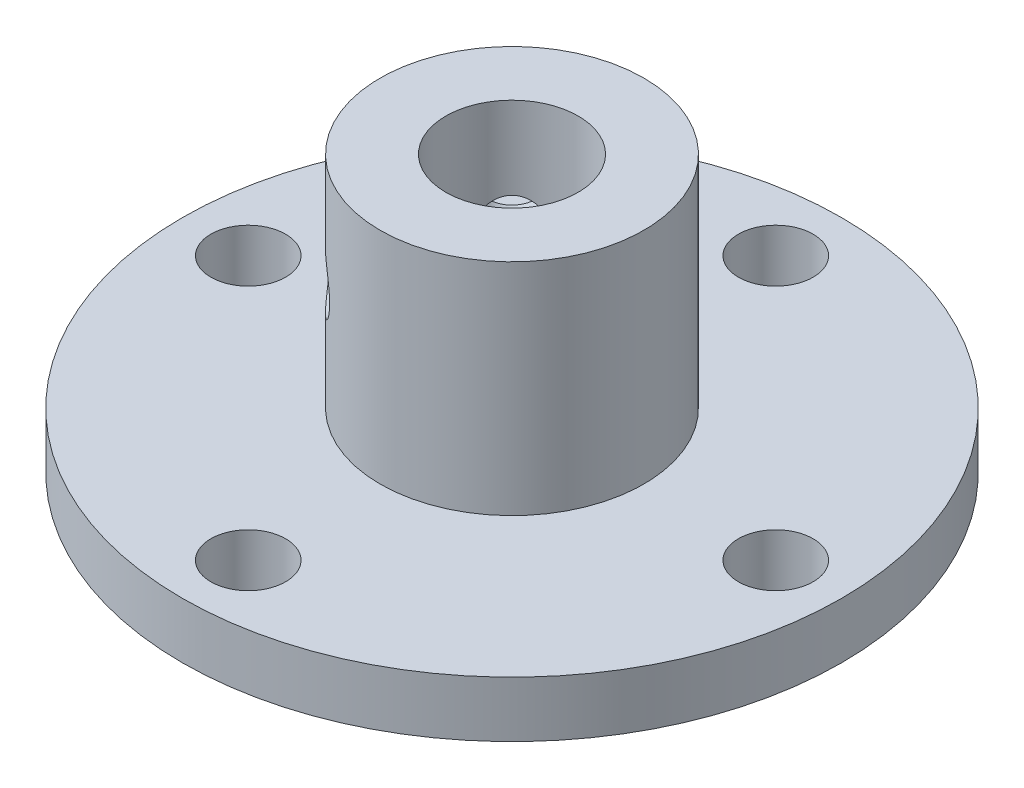
ISO-10303-21;
HEADER;
FILE_DESCRIPTION(('STEP AP214'),'2;1');
FILE_NAME('part.step','',(''),(''),'','','');
FILE_SCHEMA(('AUTOMOTIVE_DESIGN { 1 0 10303 214 1 1 1 1 }'));
ENDSEC;
DATA;
#1=APPLICATION_CONTEXT('core data for automotive mechanical design processes');
#2=APPLICATION_PROTOCOL_DEFINITION('international standard','automotive_design',2000,#1);
#3=PRODUCT_CONTEXT('',#1,'mechanical');
#4=PRODUCT('Part','Part','',(#3));
#5=PRODUCT_RELATED_PRODUCT_CATEGORY('part','',(#4));
#6=PRODUCT_DEFINITION_FORMATION('','',#4);
#7=PRODUCT_DEFINITION_CONTEXT('part definition',#1,'design');
#8=PRODUCT_DEFINITION('design','',#6,#7);
#9=PRODUCT_DEFINITION_SHAPE('','',#8);
#10=(LENGTH_UNIT() NAMED_UNIT(*) SI_UNIT(.MILLI.,.METRE.));
#11=(NAMED_UNIT(*) PLANE_ANGLE_UNIT() SI_UNIT($,.RADIAN.));
#12=(NAMED_UNIT(*) SI_UNIT($,.STERADIAN.) SOLID_ANGLE_UNIT());
#13=UNCERTAINTY_MEASURE_WITH_UNIT(LENGTH_MEASURE(1.E-05),#10,'distance_accuracy_value','');
#14=(GEOMETRIC_REPRESENTATION_CONTEXT(3) GLOBAL_UNCERTAINTY_ASSIGNED_CONTEXT((#13)) GLOBAL_UNIT_ASSIGNED_CONTEXT((#10,
#11,#12)) REPRESENTATION_CONTEXT('',''));
#15=CARTESIAN_POINT('',(0.,0.,0.));
#16=DIRECTION('',(0.,0.,1.));
#17=DIRECTION('',(1.,0.,0.));
#18=AXIS2_PLACEMENT_3D('',#15,#16,#17);
#19=CARTESIAN_POINT('',(0.,0.,0.));
#20=DIRECTION('',(0.,1.,0.));
#21=DIRECTION('',(0.,0.,1.));
#22=AXIS2_PLACEMENT_3D('',#19,#20,#21);
#23=PLANE('',#22);
#24=CARTESIAN_POINT('',(0.,0.,-12.));
#25=DIRECTION('',(0.,1.,0.));
#26=DIRECTION('',(0.,0.,1.));
#27=AXIS2_PLACEMENT_3D('',#24,#25,#26);
#28=CIRCLE('',#27,1.7);
#29=CARTESIAN_POINT('',(0.,0.,-10.3));
#30=VERTEX_POINT('',#29);
#31=EDGE_CURVE('E87',#30,#30,#28,.T.);
#32=ORIENTED_EDGE('',*,*,#31,.F.);
#33=EDGE_LOOP('',(#32));
#34=FACE_BOUND('',#33,.T.);
#35=CARTESIAN_POINT('',(12.,0.,0.));
#36=DIRECTION('',(0.,1.,0.));
#37=DIRECTION('',(0.,0.,1.));
#38=AXIS2_PLACEMENT_3D('',#35,#36,#37);
#39=CIRCLE('',#38,1.7);
#40=CARTESIAN_POINT('',(12.,0.,1.7));
#41=VERTEX_POINT('',#40);
#42=EDGE_CURVE('E81',#41,#41,#39,.T.);
#43=ORIENTED_EDGE('',*,*,#42,.F.);
#44=EDGE_LOOP('',(#43));
#45=FACE_BOUND('',#44,.T.);
#46=CARTESIAN_POINT('',(-12.,0.,0.));
#47=DIRECTION('',(0.,1.,0.));
#48=DIRECTION('',(0.,0.,1.));
#49=AXIS2_PLACEMENT_3D('',#46,#47,#48);
#50=CIRCLE('',#49,1.7);
#51=CARTESIAN_POINT('',(-12.,0.,1.7));
#52=VERTEX_POINT('',#51);
#53=EDGE_CURVE('E75',#52,#52,#50,.T.);
#54=ORIENTED_EDGE('',*,*,#53,.F.);
#55=EDGE_LOOP('',(#54));
#56=FACE_BOUND('',#55,.T.);
#57=CARTESIAN_POINT('',(0.,0.,12.));
#58=DIRECTION('',(0.,1.,0.));
#59=DIRECTION('',(0.,0.,1.));
#60=AXIS2_PLACEMENT_3D('',#57,#58,#59);
#61=CIRCLE('',#60,1.7);
#62=CARTESIAN_POINT('',(0.,0.,13.7));
#63=VERTEX_POINT('',#62);
#64=EDGE_CURVE('E69',#63,#63,#61,.T.);
#65=ORIENTED_EDGE('',*,*,#64,.F.);
#66=EDGE_LOOP('',(#65));
#67=FACE_BOUND('',#66,.T.);
#68=CARTESIAN_POINT('',(0.,0.,0.));
#69=DIRECTION('',(0.,1.,0.));
#70=DIRECTION('',(0.,0.,1.));
#71=AXIS2_PLACEMENT_3D('',#68,#69,#70);
#72=CIRCLE('',#71,15.);
#73=CARTESIAN_POINT('',(0.,0.,15.));
#74=VERTEX_POINT('',#73);
#75=EDGE_CURVE('E47',#74,#74,#72,.T.);
#76=ORIENTED_EDGE('',*,*,#75,.T.);
#77=EDGE_LOOP('',(#76));
#78=FACE_BOUND('',#77,.T.);
#79=CARTESIAN_POINT('',(0.,0.,0.));
#80=DIRECTION('',(0.,1.,0.));
#81=DIRECTION('',(0.,0.,1.));
#82=AXIS2_PLACEMENT_3D('',#79,#80,#81);
#83=CIRCLE('',#82,6.);
#84=CARTESIAN_POINT('',(0.,0.,6.));
#85=VERTEX_POINT('',#84);
#86=EDGE_CURVE('E57',#85,#85,#83,.T.);
#87=ORIENTED_EDGE('',*,*,#86,.F.);
#88=EDGE_LOOP('',(#87));
#89=FACE_BOUND('',#88,.T.);
#90=ADVANCED_FACE('F43',(#34,#45,#56,#67,#78,#89),#23,.T.);
#91=CARTESIAN_POINT('',(0.,-2.54,0.));
#92=DIRECTION('',(0.,1.,0.));
#93=DIRECTION('',(0.,0.,1.));
#94=AXIS2_PLACEMENT_3D('',#91,#92,#93);
#95=CYLINDRICAL_SURFACE('',#94,15.);
#96=CARTESIAN_POINT('',(0.,-2.54,0.));
#97=DIRECTION('',(0.,1.,0.));
#98=DIRECTION('',(0.,0.,1.));
#99=AXIS2_PLACEMENT_3D('',#96,#97,#98);
#100=CIRCLE('',#99,15.);
#101=CARTESIAN_POINT('',(0.,-2.54,15.));
#102=VERTEX_POINT('',#101);
#103=EDGE_CURVE('E51',#102,#102,#100,.T.);
#104=ORIENTED_EDGE('',*,*,#103,.T.);
#105=EDGE_LOOP('',(#104));
#106=FACE_BOUND('',#105,.T.);
#107=ORIENTED_EDGE('',*,*,#75,.F.);
#108=EDGE_LOOP('',(#107));
#109=FACE_BOUND('',#108,.T.);
#110=ADVANCED_FACE('F45',(#106,#109),#95,.T.);
#111=CARTESIAN_POINT('',(0.,-2.54,0.));
#112=DIRECTION('',(0.,1.,0.));
#113=DIRECTION('',(0.,0.,1.));
#114=AXIS2_PLACEMENT_3D('',#111,#112,#113);
#115=CYLINDRICAL_SURFACE('',#114,3.01);
#116=CARTESIAN_POINT('',(-1.05229833316179,5.,2.82006528612813));
#117=CARTESIAN_POINT('',(-1.05230850894781,5.06669451576481,2.82006510342933));
#118=CARTESIAN_POINT('',(-1.05784477507357,5.13349886235399,2.81801514124901));
#119=CARTESIAN_POINT('',(-1.07962290833897,5.26518098967737,2.80974034838367));
#120=CARTESIAN_POINT('',(-1.09589393513423,5.33005301844645,2.80350414548228));
#121=CARTESIAN_POINT('',(-1.13795361916978,5.45572843142163,2.78669488005458));
#122=CARTESIAN_POINT('',(-1.16370364040381,5.5165471644543,2.77613940349236));
#123=CARTESIAN_POINT('',(-1.22325256804788,5.63299675364323,2.75041830148006));
#124=CARTESIAN_POINT('',(-1.25704953308596,5.68862885660622,2.73525378774335));
#125=CARTESIAN_POINT('',(-1.333209490276,5.79659829553751,2.69898609296384));
#126=CARTESIAN_POINT('',(-1.37594640040534,5.84857624812723,2.67759771818537));
#127=CARTESIAN_POINT('',(-1.4668164803885,5.9444556170921,2.62891707047193));
#128=CARTESIAN_POINT('',(-1.51495171143107,5.98835393148467,2.60162253872366));
#129=CARTESIAN_POINT('',(-1.61690547441177,6.06865632700813,2.53957152427215));
#130=CARTESIAN_POINT('',(-1.67087944186753,6.10465658155066,2.50454446080582));
#131=CARTESIAN_POINT('',(-1.78044322773509,6.16540391019308,2.42787602408268));
#132=CARTESIAN_POINT('',(-1.83603232181857,6.19015594831654,2.38623757950664));
#133=CARTESIAN_POINT('',(-1.94367822207137,6.22640334996112,2.29929352394336));
#134=CARTESIAN_POINT('',(-1.99576898626037,6.23851829902275,2.25428907995295));
#135=CARTESIAN_POINT('',(-2.09742899112113,6.25114907381373,2.16002064227818));
#136=CARTESIAN_POINT('',(-2.14699923938579,6.25166957145631,2.1107583722917));
#137=CARTESIAN_POINT('',(-2.2391130381813,6.24142259533875,2.01264261777047));
#138=CARTESIAN_POINT('',(-2.28190022606599,6.23133572089069,1.96394450735866));
#139=CARTESIAN_POINT('',(-2.36285673708798,6.2013262647997,1.86575949607225));
#140=CARTESIAN_POINT('',(-2.40102571965753,6.18140295832269,1.81627253732853));
#141=CARTESIAN_POINT('',(-2.47274384868023,6.1320484995314,1.71739003285284));
#142=CARTESIAN_POINT('',(-2.50621368504488,6.10247701535219,1.66800738469828));
#143=CARTESIAN_POINT('',(-2.56768016708329,6.03480259792682,1.57174587457617));
#144=CARTESIAN_POINT('',(-2.59567487619386,5.99669665621247,1.52486790276319));
#145=CARTESIAN_POINT('',(-2.64808350467646,5.90992847702047,1.43205806574556));
#146=CARTESIAN_POINT('',(-2.67210895216509,5.86071357105489,1.38642277349947));
#147=CARTESIAN_POINT('',(-2.71437544271745,5.7546853080728,1.30173381961676));
#148=CARTESIAN_POINT('',(-2.73261428446544,5.69786907104757,1.26268266533044));
#149=CARTESIAN_POINT('',(-2.76421688228876,5.5759190018515,1.19195558487579));
#150=CARTESIAN_POINT('',(-2.77740315230633,5.51057502719124,1.16056024318383));
#151=CARTESIAN_POINT('',(-2.79843297390319,5.37482912428841,1.10890037483814));
#152=CARTESIAN_POINT('',(-2.80628031677354,5.30443082459106,1.08862795153646));
#153=CARTESIAN_POINT('',(-2.81657688556831,5.16542670678378,1.06169238624938));
#154=CARTESIAN_POINT('',(-2.81934196249916,5.09699867935287,1.05423498338582));
#155=CARTESIAN_POINT('',(-2.82054021910058,4.95984174160622,1.05102722736378));
#156=CARTESIAN_POINT('',(-2.81897488098071,4.89111294227829,1.05527286849888));
#157=CARTESIAN_POINT('',(-2.81170322628318,4.75989663591638,1.07448427279368));
#158=CARTESIAN_POINT('',(-2.80626579208061,4.6972897203449,1.08875317873601));
#159=CARTESIAN_POINT('',(-2.79139803064734,4.57535320148066,1.12632237999925));
#160=CARTESIAN_POINT('',(-2.78196677418814,4.51602436452074,1.14962477700382));
#161=CARTESIAN_POINT('',(-2.75838437205167,4.39952996279825,1.20513856431736));
#162=CARTESIAN_POINT('',(-2.7440508050412,4.34256141194632,1.23768448276713));
#163=CARTESIAN_POINT('',(-2.71045211388594,4.23472280933532,1.30962741525887));
#164=CARTESIAN_POINT('',(-2.69118486450101,4.18385539961326,1.3490273794084));
#165=CARTESIAN_POINT('',(-2.6456055288193,4.08538775398803,1.43648554457723));
#166=CARTESIAN_POINT('',(-2.61885014818771,4.03838319308904,1.48498602158441));
#167=CARTESIAN_POINT('',(-2.55886912606627,3.9538651765227,1.5861087533393));
#168=CARTESIAN_POINT('',(-2.52564302951281,3.91635238880659,1.63873129782243));
#169=CARTESIAN_POINT('',(-2.452616697047,3.85193277442742,1.74613651228401));
#170=CARTESIAN_POINT('',(-2.41280147820792,3.82505060399506,1.80092388357848));
#171=CARTESIAN_POINT('',(-2.32714965496008,3.78311510067065,1.91031085306114));
#172=CARTESIAN_POINT('',(-2.28131662644881,3.76805477980896,1.96491054315497));
#173=CARTESIAN_POINT('',(-2.18811751024725,3.75106629838009,2.06802670814363));
#174=CARTESIAN_POINT('',(-2.141079455402,3.74829805779298,2.11670221723164));
#175=CARTESIAN_POINT('',(-2.04414665135264,3.7537171748681,2.21045417425018));
#176=CARTESIAN_POINT('',(-1.99425239852633,3.76190263438966,2.25553124431143));
#177=CARTESIAN_POINT('',(-1.89506860656129,3.78839381033776,2.3394210965581));
#178=CARTESIAN_POINT('',(-1.84581920319283,3.80633462369603,2.37839810311129));
#179=CARTESIAN_POINT('',(-1.74782392702401,3.85143023411384,2.45131504098731));
#180=CARTESIAN_POINT('',(-1.69907815202641,3.87858678742438,2.48525401043395));
#181=CARTESIAN_POINT('',(-1.60151114085842,3.94271429331614,2.54927845317059));
#182=CARTESIAN_POINT('',(-1.55278577563592,3.98007285129563,2.57912090183712));
#183=CARTESIAN_POINT('',(-1.4593146413203,4.06297809780971,2.63313878875612));
#184=CARTESIAN_POINT('',(-1.41457034664162,4.10852780127335,2.65731213279739));
#185=CARTESIAN_POINT('',(-1.32790804550534,4.21015009728013,2.70171973414813));
#186=CARTESIAN_POINT('',(-1.28638482440392,4.26672552036164,2.72157784576064));
#187=CARTESIAN_POINT('',(-1.2118215352316,4.38683660958001,2.75558976233852));
#188=CARTESIAN_POINT('',(-1.17878619222424,4.45037612455963,2.76974039252855));
#189=CARTESIAN_POINT('',(-1.12339474275041,4.58242911352445,2.79266582382577));
#190=CARTESIAN_POINT('',(-1.10097795250545,4.65091168120492,2.80147125557924));
#191=CARTESIAN_POINT('',(-1.06828091816975,4.79101793910788,2.81410670729308));
#192=CARTESIAN_POINT('',(-1.05795996850118,4.86263024795976,2.81795341899999));
#193=CARTESIAN_POINT('',(-1.0528846817651,4.95631553874504,2.8198454400148));
#194=CARTESIAN_POINT('',(-1.05229499972681,4.97815187629312,2.82006534597752));
#195=CARTESIAN_POINT('',(-1.05229833316179,5.,2.82006528612813));
#196=B_SPLINE_CURVE_WITH_KNOTS('',3,(#116,#117,#118,#119,#120,#121,#122,#123,#124,#125,#126,
#127,#128,#129,#130,#131,#132,#133,#134,#135,#136,#137,#138,#139,#140,#141,#142,#143,#144,#145,
#146,#147,#148,#149,#150,#151,#152,#153,#154,#155,#156,#157,#158,#159,#160,#161,#162,#163,#164,
#165,#166,#167,#168,#169,#170,#171,#172,#173,#174,#175,#176,#177,#178,#179,#180,#181,#182,#183,
#184,#185,#186,#187,#188,#189,#190,#191,#192,#193,#194,#195),.UNSPECIFIED.,.T.,.F.,(4,2,2,2,2,2,
2,2,2,2,2,2,2,2,2,2,2,2,2,2,2,2,2,2,2,2,2,2,2,2,2,2,2,2,2,2,2,2,2,4),(0.,0.200021294265479,
0.400588171241676,0.60034643736371,0.800056559388379,1.01095912903077,1.22194250150127,
1.442005769668,1.66197182574289,1.87055792632632,2.07905997689644,2.27495541406531,
2.47086528867313,2.66976214238162,2.86872921956925,3.0816410321659,3.2946337429147,
3.51454101932696,3.73429197123238,3.939852982544,4.14534364337184,4.33780371637072,
4.53030859299851,4.73093901848576,4.93165601363778,5.14858381812736,5.36552688393026,
5.58297020847078,5.80028490390208,6.00249347195753,6.2046670043077,6.39975185498399,
6.59487390403489,6.79880159307689,7.00280449634256,7.22058092470023,7.43847832425806,
7.65511497652256,7.8710204787151,7.93654445667654),.UNSPECIFIED.);
#197=CARTESIAN_POINT('',(-1.05229833316179,5.,2.82006528612813));
#198=VERTEX_POINT('',#197);
#199=EDGE_CURVE('E162',#198,#198,#196,.T.);
#200=ORIENTED_EDGE('',*,*,#199,.T.);
#201=EDGE_LOOP('',(#200));
#202=FACE_BOUND('',#201,.T.);
#203=CARTESIAN_POINT('',(-2.82006528612813,5.,-1.05229833316178));
#204=CARTESIAN_POINT('',(-2.82006510342933,5.06669451576481,-1.0523085089478));
#205=CARTESIAN_POINT('',(-2.81801514124901,5.13349886235399,-1.05784477507356));
#206=CARTESIAN_POINT('',(-2.80974034838367,5.26518098967737,-1.07962290833896));
#207=CARTESIAN_POINT('',(-2.80350414548228,5.33005301844645,-1.09589393513422));
#208=CARTESIAN_POINT('',(-2.78669488005458,5.45572843142163,-1.13795361916977));
#209=CARTESIAN_POINT('',(-2.77613940349236,5.51654716445431,-1.1637036404038));
#210=CARTESIAN_POINT('',(-2.75041830148006,5.63299675364323,-1.22325256804787));
#211=CARTESIAN_POINT('',(-2.73525378774335,5.68862885660622,-1.25704953308596));
#212=CARTESIAN_POINT('',(-2.69898609296384,5.79659829553751,-1.33320949027599));
#213=CARTESIAN_POINT('',(-2.67759771818537,5.84857624812723,-1.37594640040533));
#214=CARTESIAN_POINT('',(-2.62891707047193,5.9444556170921,-1.46681648038849));
#215=CARTESIAN_POINT('',(-2.60162253872367,5.98835393148467,-1.51495171143106));
#216=CARTESIAN_POINT('',(-2.53957152427216,6.06865632700813,-1.61690547441176));
#217=CARTESIAN_POINT('',(-2.50454446080582,6.10465658155066,-1.67087944186752));
#218=CARTESIAN_POINT('',(-2.42787602408269,6.16540391019309,-1.78044322773508));
#219=CARTESIAN_POINT('',(-2.38623757950664,6.19015594831655,-1.83603232181857));
#220=CARTESIAN_POINT('',(-2.29929352394337,6.22640334996112,-1.94367822207137));
#221=CARTESIAN_POINT('',(-2.25428907995296,6.23851829902275,-1.99576898626036));
#222=CARTESIAN_POINT('',(-2.16002064227819,6.25114907381373,-2.09742899112112));
#223=CARTESIAN_POINT('',(-2.11075837229171,6.25166957145631,-2.14699923938578));
#224=CARTESIAN_POINT('',(-2.01264261777048,6.24142259533875,-2.23911303818129));
#225=CARTESIAN_POINT('',(-1.96394450735867,6.23133572089069,-2.28190022606598));
#226=CARTESIAN_POINT('',(-1.86575949607226,6.2013262647997,-2.36285673708797));
#227=CARTESIAN_POINT('',(-1.81627253732854,6.18140295832269,-2.40102571965753));
#228=CARTESIAN_POINT('',(-1.71739003285284,6.1320484995314,-2.47274384868022));
#229=CARTESIAN_POINT('',(-1.66800738469829,6.10247701535219,-2.50621368504487));
#230=CARTESIAN_POINT('',(-1.57174587457618,6.03480259792682,-2.56768016708328));
#231=CARTESIAN_POINT('',(-1.5248679027632,5.99669665621247,-2.59567487619385));
#232=CARTESIAN_POINT('',(-1.43205806574556,5.90992847702047,-2.64808350467646));
#233=CARTESIAN_POINT('',(-1.38642277349948,5.86071357105489,-2.67210895216508));
#234=CARTESIAN_POINT('',(-1.30173381961677,5.7546853080728,-2.71437544271745));
#235=CARTESIAN_POINT('',(-1.26268266533045,5.69786907104757,-2.73261428446544));
#236=CARTESIAN_POINT('',(-1.1919555848758,5.5759190018515,-2.76421688228875));
#237=CARTESIAN_POINT('',(-1.16056024318384,5.51057502719123,-2.77740315230632));
#238=CARTESIAN_POINT('',(-1.10890037483815,5.37482912428841,-2.79843297390318));
#239=CARTESIAN_POINT('',(-1.08862795153647,5.30443082459106,-2.80628031677354));
#240=CARTESIAN_POINT('',(-1.06169238624939,5.16542670678378,-2.81657688556831));
#241=CARTESIAN_POINT('',(-1.05423498338583,5.09699867935287,-2.81934196249916));
#242=CARTESIAN_POINT('',(-1.05102722736379,4.95984174160623,-2.82054021910058));
#243=CARTESIAN_POINT('',(-1.05527286849889,4.89111294227829,-2.81897488098071));
#244=CARTESIAN_POINT('',(-1.07448427279369,4.75989663591638,-2.81170322628318));
#245=CARTESIAN_POINT('',(-1.08875317873602,4.6972897203449,-2.80626579208061));
#246=CARTESIAN_POINT('',(-1.12632237999926,4.57535320148066,-2.79139803064733));
#247=CARTESIAN_POINT('',(-1.14962477700383,4.51602436452074,-2.78196677418813));
#248=CARTESIAN_POINT('',(-1.20513856431737,4.39952996279825,-2.75838437205167));
#249=CARTESIAN_POINT('',(-1.23768448276714,4.34256141194632,-2.74405080504119));
#250=CARTESIAN_POINT('',(-1.30962741525887,4.23472280933532,-2.71045211388594));
#251=CARTESIAN_POINT('',(-1.34902737940841,4.18385539961326,-2.69118486450101));
#252=CARTESIAN_POINT('',(-1.43648554457724,4.08538775398803,-2.6456055288193));
#253=CARTESIAN_POINT('',(-1.48498602158441,4.03838319308904,-2.6188501481877));
#254=CARTESIAN_POINT('',(-1.5861087533393,3.9538651765227,-2.55886912606627));
#255=CARTESIAN_POINT('',(-1.63873129782244,3.91635238880659,-2.52564302951281));
#256=CARTESIAN_POINT('',(-1.74613651228401,3.85193277442742,-2.452616697047));
#257=CARTESIAN_POINT('',(-1.80092388357849,3.82505060399506,-2.41280147820791));
#258=CARTESIAN_POINT('',(-1.91031085306115,3.78311510067065,-2.32714965496007));
#259=CARTESIAN_POINT('',(-1.96491054315498,3.76805477980896,-2.2813166264488));
#260=CARTESIAN_POINT('',(-2.06802670814364,3.75106629838009,-2.18811751024725));
#261=CARTESIAN_POINT('',(-2.11670221723164,3.74829805779298,-2.141079455402));
#262=CARTESIAN_POINT('',(-2.21045417425018,3.7537171748681,-2.04414665135263));
#263=CARTESIAN_POINT('',(-2.25553124431144,3.76190263438966,-1.99425239852632));
#264=CARTESIAN_POINT('',(-2.33942109655811,3.78839381033776,-1.89506860656128));
#265=CARTESIAN_POINT('',(-2.3783981031113,3.80633462369603,-1.84581920319283));
#266=CARTESIAN_POINT('',(-2.45131504098731,3.85143023411384,-1.747823927024));
#267=CARTESIAN_POINT('',(-2.48525401043395,3.87858678742438,-1.6990781520264));
#268=CARTESIAN_POINT('',(-2.5492784531706,3.94271429331614,-1.60151114085841));
#269=CARTESIAN_POINT('',(-2.57912090183712,3.98007285129563,-1.55278577563591));
#270=CARTESIAN_POINT('',(-2.63313878875612,4.06297809780971,-1.45931464132029));
#271=CARTESIAN_POINT('',(-2.6573121327974,4.10852780127335,-1.41457034664161));
#272=CARTESIAN_POINT('',(-2.70171973414814,4.21015009728013,-1.32790804550533));
#273=CARTESIAN_POINT('',(-2.72157784576064,4.26672552036164,-1.28638482440391));
#274=CARTESIAN_POINT('',(-2.75558976233852,4.38683660958001,-1.21182153523159));
#275=CARTESIAN_POINT('',(-2.76974039252855,4.45037612455963,-1.17878619222423));
#276=CARTESIAN_POINT('',(-2.79266582382577,4.58242911352445,-1.1233947427504));
#277=CARTESIAN_POINT('',(-2.80147125557924,4.65091168120492,-1.10097795250544));
#278=CARTESIAN_POINT('',(-2.81410670729309,4.79101793910788,-1.06828091816975));
#279=CARTESIAN_POINT('',(-2.81795341899999,4.86263024795976,-1.05795996850117));
#280=CARTESIAN_POINT('',(-2.81984544001481,4.95631553874504,-1.05288468176509));
#281=CARTESIAN_POINT('',(-2.82006534597752,4.97815187629312,-1.0522949997268));
#282=CARTESIAN_POINT('',(-2.82006528612813,5.,-1.05229833316178));
#283=B_SPLINE_CURVE_WITH_KNOTS('',3,(#203,#204,#205,#206,#207,#208,#209,#210,#211,#212,#213,
#214,#215,#216,#217,#218,#219,#220,#221,#222,#223,#224,#225,#226,#227,#228,#229,#230,#231,#232,
#233,#234,#235,#236,#237,#238,#239,#240,#241,#242,#243,#244,#245,#246,#247,#248,#249,#250,#251,
#252,#253,#254,#255,#256,#257,#258,#259,#260,#261,#262,#263,#264,#265,#266,#267,#268,#269,#270,
#271,#272,#273,#274,#275,#276,#277,#278,#279,#280,#281,#282),.UNSPECIFIED.,.T.,.F.,(4,2,2,2,2,2,
2,2,2,2,2,2,2,2,2,2,2,2,2,2,2,2,2,2,2,2,2,2,2,2,2,2,2,2,2,2,2,2,2,4),(0.,0.200021294265479,
0.400588171241676,0.600346437363709,0.800056559388379,1.01095912903077,1.22194250150127,
1.44200576966801,1.66197182574289,1.87055792632632,2.07905997689644,2.27495541406531,
2.47086528867313,2.66976214238162,2.86872921956925,3.0816410321659,3.2946337429147,
3.51454101932697,3.73429197123238,3.939852982544,4.14534364337184,4.33780371637072,
4.53030859299852,4.73093901848576,4.93165601363778,5.14858381812736,5.36552688393026,
5.58297020847078,5.80028490390208,6.00249347195752,6.2046670043077,6.39975185498399,
6.59487390403489,6.79880159307689,7.00280449634256,7.22058092470023,7.43847832425806,
7.65511497652256,7.8710204787151,7.93654445667654),.UNSPECIFIED.);
#284=CARTESIAN_POINT('',(-2.82006528612813,5.,-1.05229833316178));
#285=VERTEX_POINT('',#284);
#286=EDGE_CURVE('E98',#285,#285,#283,.T.);
#287=ORIENTED_EDGE('',*,*,#286,.T.);
#288=EDGE_LOOP('',(#287));
#289=FACE_BOUND('',#288,.T.);
#290=CARTESIAN_POINT('',(0.,-2.54,0.));
#291=DIRECTION('',(0.,1.,0.));
#292=DIRECTION('',(0.,0.,1.));
#293=AXIS2_PLACEMENT_3D('',#290,#291,#292);
#294=CIRCLE('',#293,3.01);
#295=CARTESIAN_POINT('',(0.,-2.54,3.01));
#296=VERTEX_POINT('',#295);
#297=EDGE_CURVE('E11',#296,#296,#294,.T.);
#298=ORIENTED_EDGE('',*,*,#297,.F.);
#299=EDGE_LOOP('',(#298));
#300=FACE_BOUND('',#299,.T.);
#301=CARTESIAN_POINT('',(0.,10.,0.));
#302=DIRECTION('',(0.,1.,0.));
#303=DIRECTION('',(0.,0.,1.));
#304=AXIS2_PLACEMENT_3D('',#301,#302,#303);
#305=CIRCLE('',#304,3.01);
#306=CARTESIAN_POINT('',(0.,10.,3.01));
#307=VERTEX_POINT('',#306);
#308=EDGE_CURVE('E61',#307,#307,#305,.T.);
#309=ORIENTED_EDGE('',*,*,#308,.T.);
#310=EDGE_LOOP('',(#309));
#311=FACE_BOUND('',#310,.T.);
#312=ADVANCED_FACE('F145',(#202,#289,#300,#311),#115,.F.);
#313=CARTESIAN_POINT('',(0.,-2.54,0.));
#314=DIRECTION('',(0.,1.,0.));
#315=DIRECTION('',(0.,0.,1.));
#316=AXIS2_PLACEMENT_3D('',#313,#314,#315);
#317=PLANE('',#316);
#318=CARTESIAN_POINT('',(0.,-2.54,-12.));
#319=DIRECTION('',(0.,1.,0.));
#320=DIRECTION('',(0.,0.,1.));
#321=AXIS2_PLACEMENT_3D('',#318,#319,#320);
#322=CIRCLE('',#321,1.7);
#323=CARTESIAN_POINT('',(0.,-2.54,-10.3));
#324=VERTEX_POINT('',#323);
#325=EDGE_CURVE('E84',#324,#324,#322,.T.);
#326=ORIENTED_EDGE('',*,*,#325,.T.);
#327=EDGE_LOOP('',(#326));
#328=FACE_BOUND('',#327,.T.);
#329=CARTESIAN_POINT('',(12.,-2.54,0.));
#330=DIRECTION('',(0.,1.,0.));
#331=DIRECTION('',(0.,0.,1.));
#332=AXIS2_PLACEMENT_3D('',#329,#330,#331);
#333=CIRCLE('',#332,1.7);
#334=CARTESIAN_POINT('',(12.,-2.54,1.7));
#335=VERTEX_POINT('',#334);
#336=EDGE_CURVE('E78',#335,#335,#333,.T.);
#337=ORIENTED_EDGE('',*,*,#336,.T.);
#338=EDGE_LOOP('',(#337));
#339=FACE_BOUND('',#338,.T.);
#340=CARTESIAN_POINT('',(-12.,-2.54,0.));
#341=DIRECTION('',(0.,1.,0.));
#342=DIRECTION('',(0.,0.,1.));
#343=AXIS2_PLACEMENT_3D('',#340,#341,#342);
#344=CIRCLE('',#343,1.7);
#345=CARTESIAN_POINT('',(-12.,-2.54,1.7));
#346=VERTEX_POINT('',#345);
#347=EDGE_CURVE('E72',#346,#346,#344,.T.);
#348=ORIENTED_EDGE('',*,*,#347,.T.);
#349=EDGE_LOOP('',(#348));
#350=FACE_BOUND('',#349,.T.);
#351=CARTESIAN_POINT('',(0.,-2.54,12.));
#352=DIRECTION('',(0.,1.,0.));
#353=DIRECTION('',(0.,0.,1.));
#354=AXIS2_PLACEMENT_3D('',#351,#352,#353);
#355=CIRCLE('',#354,1.7);
#356=CARTESIAN_POINT('',(0.,-2.54,13.7));
#357=VERTEX_POINT('',#356);
#358=EDGE_CURVE('E66',#357,#357,#355,.T.);
#359=ORIENTED_EDGE('',*,*,#358,.T.);
#360=EDGE_LOOP('',(#359));
#361=FACE_BOUND('',#360,.T.);
#362=ORIENTED_EDGE('',*,*,#103,.F.);
#363=EDGE_LOOP('',(#362));
#364=FACE_BOUND('',#363,.T.);
#365=ORIENTED_EDGE('',*,*,#297,.T.);
#366=EDGE_LOOP('',(#365));
#367=FACE_BOUND('',#366,.T.);
#368=ADVANCED_FACE('F136',(#328,#339,#350,#361,#364,#367),#317,.F.);
#369=CARTESIAN_POINT('',(0.,10.,0.));
#370=DIRECTION('',(0.,1.,0.));
#371=DIRECTION('',(0.,0.,1.));
#372=AXIS2_PLACEMENT_3D('',#369,#370,#371);
#373=PLANE('',#372);
#374=CARTESIAN_POINT('',(0.,10.,0.));
#375=DIRECTION('',(0.,1.,0.));
#376=DIRECTION('',(0.,0.,1.));
#377=AXIS2_PLACEMENT_3D('',#374,#375,#376);
#378=CIRCLE('',#377,6.);
#379=CARTESIAN_POINT('',(0.,10.,6.));
#380=VERTEX_POINT('',#379);
#381=EDGE_CURVE('E60',#380,#380,#378,.T.);
#382=ORIENTED_EDGE('',*,*,#381,.T.);
#383=EDGE_LOOP('',(#382));
#384=FACE_BOUND('',#383,.T.);
#385=ORIENTED_EDGE('',*,*,#308,.F.);
#386=EDGE_LOOP('',(#385));
#387=FACE_BOUND('',#386,.T.);
#388=ADVANCED_FACE('F134',(#384,#387),#373,.T.);
#389=CARTESIAN_POINT('',(0.,10.,0.));
#390=DIRECTION('',(0.,-1.,0.));
#391=DIRECTION('',(0.,0.,-1.));
#392=AXIS2_PLACEMENT_3D('',#389,#390,#391);
#393=CYLINDRICAL_SURFACE('',#392,6.);
#394=CARTESIAN_POINT('',(-3.26566469169131,5.,5.03343164465762));
#395=CARTESIAN_POINT('',(-3.26566743965513,4.93060938484897,5.03343086949867));
#396=CARTESIAN_POINT('',(-3.27064404413182,4.86118802798478,5.03021180312238));
#397=CARTESIAN_POINT('',(-3.29032600682458,4.72431368268275,5.01735864861108));
#398=CARTESIAN_POINT('',(-3.3050388225222,4.65686224449358,5.00771964306684));
#399=CARTESIAN_POINT('',(-3.34349710705122,4.52592762716513,4.98212369910279));
#400=CARTESIAN_POINT('',(-3.36723318972377,4.4624404040082,4.96617332517555));
#401=CARTESIAN_POINT('',(-3.42271213918901,4.3410755003544,4.9280998887324));
#402=CARTESIAN_POINT('',(-3.45445468237507,4.28319759326999,4.90597707569148));
#403=CARTESIAN_POINT('',(-3.52516273340151,4.17380462484654,4.8554234867882));
#404=CARTESIAN_POINT('',(-3.56422164443291,4.12238810637353,4.82691007936971));
#405=CARTESIAN_POINT('',(-3.64777186515497,4.0282389313519,4.76408307144272));
#406=CARTESIAN_POINT('',(-3.69226357289425,3.98550691170857,4.72976904586527));
#407=CARTESIAN_POINT('',(-3.78550979896244,3.90955411191715,4.65548031737169));
#408=CARTESIAN_POINT('',(-3.83430077491858,3.87642747353675,4.61545496959061));
#409=CARTESIAN_POINT('',(-3.93404155528709,3.82123394714023,4.53073863447317));
#410=CARTESIAN_POINT('',(-3.98499113967264,3.79916593484648,4.48604812198023));
#411=CARTESIAN_POINT('',(-4.08657726703135,3.76702423888253,4.39369199139599));
#412=CARTESIAN_POINT('',(-4.13720791141682,3.75678398280484,4.34607789378143));
#413=CARTESIAN_POINT('',(-4.23727323538828,3.74806830424299,4.24857541640553));
#414=CARTESIAN_POINT('',(-4.28670803906095,3.7495916558069,4.19868727417389));
#415=CARTESIAN_POINT('',(-4.38220459200329,3.76423460095675,4.09890001689591));
#416=CARTESIAN_POINT('',(-4.42830664682889,3.77717471895812,4.0490129731401));
#417=CARTESIAN_POINT('',(-4.51682908807618,3.81399862533131,3.95002113635885));
#418=CARTESIAN_POINT('',(-4.55924931847673,3.83788287720308,3.90091637655542));
#419=CARTESIAN_POINT('',(-4.63979971144758,3.8960800521255,3.80476316379363));
#420=CARTESIAN_POINT('',(-4.67789897668216,3.93046229420966,3.75773083193625));
#421=CARTESIAN_POINT('',(-4.74883471605457,4.00862800284042,3.66767770151169));
#422=CARTESIAN_POINT('',(-4.78167053500203,4.05241263820613,3.62465740263807));
#423=CARTESIAN_POINT('',(-4.84220445044996,4.14912162489106,3.54339891257088));
#424=CARTESIAN_POINT('',(-4.86979372881815,4.20220305998195,3.50526645632368));
#425=CARTESIAN_POINT('',(-4.91873708750341,4.3154820489948,3.43625099021855));
#426=CARTESIAN_POINT('',(-4.94009102893068,4.37567976138724,3.40536814184593));
#427=CARTESIAN_POINT('',(-4.97639984704053,4.5017122548288,3.35208764703979));
#428=CARTESIAN_POINT('',(-4.99133871646205,4.56756065069343,3.3297112421424));
#429=CARTESIAN_POINT('',(-5.01459753192455,4.70289161936939,3.29458040332925));
#430=CARTESIAN_POINT('',(-5.02291842115802,4.77237367280809,3.28182459830199));
#431=CARTESIAN_POINT('',(-5.03277345121642,4.91161970631891,3.26669133760035));
#432=CARTESIAN_POINT('',(-5.03443053952019,4.98135458453703,3.26412588047073));
#433=CARTESIAN_POINT('',(-5.03128144425393,5.12032581154014,3.26897769106136));
#434=CARTESIAN_POINT('',(-5.02647566056189,5.18956219090233,3.27639434115763));
#435=CARTESIAN_POINT('',(-5.01053104993991,5.32482051605812,3.30072481498047));
#436=CARTESIAN_POINT('',(-4.99945956870511,5.39086866717883,3.31753762224455));
#437=CARTESIAN_POINT('',(-4.97113143353218,5.5187239894416,3.35983574393727));
#438=CARTESIAN_POINT('',(-4.95387423361719,5.5805307856504,3.3853218238944));
#439=CARTESIAN_POINT('',(-4.9130422632404,5.69910644121623,3.44431645060973));
#440=CARTESIAN_POINT('',(-4.8893820408809,5.75579220446616,3.4779328030738));
#441=CARTESIAN_POINT('',(-4.83609368660874,5.86164324915506,3.55165622294044));
#442=CARTESIAN_POINT('',(-4.80646488551864,5.91080768623922,3.59176401804302));
#443=CARTESIAN_POINT('',(-4.74104468547153,6.00106271309716,3.6776968703344));
#444=CARTESIAN_POINT('',(-4.70515828150303,6.04200409502638,3.72360651862795));
#445=CARTESIAN_POINT('',(-4.62813210400659,6.11358875208798,3.81891895906091));
#446=CARTESIAN_POINT('',(-4.58699256270723,6.14423248223744,3.86832159674058));
#447=CARTESIAN_POINT('',(-4.50052507619469,6.19413867931734,3.96857979175438));
#448=CARTESIAN_POINT('',(-4.45522409766918,6.21346916554433,4.01942469767881));
#449=CARTESIAN_POINT('',(-4.36129957929125,6.24041440400809,4.12114716522651));
#450=CARTESIAN_POINT('',(-4.31267647628568,6.24803069353273,4.17202472168811));
#451=CARTESIAN_POINT('',(-4.21439229241866,6.25126762204851,4.27126254814274));
#452=CARTESIAN_POINT('',(-4.16476811004897,6.24711189999472,4.31965220265252));
#453=CARTESIAN_POINT('',(-4.06509032548405,6.22741936134706,4.41358489084519));
#454=CARTESIAN_POINT('',(-4.0150367296702,6.21188271359322,4.45912796674721));
#455=CARTESIAN_POINT('',(-3.91622084714692,6.16997220535143,4.54615677386023));
#456=CARTESIAN_POINT('',(-3.8674554746125,6.14362733614689,4.58765299435618));
#457=CARTESIAN_POINT('',(-3.77267587315696,6.08087760226799,4.66590810345865));
#458=CARTESIAN_POINT('',(-3.72666188420599,6.04447186165686,4.70266657917074));
#459=CARTESIAN_POINT('',(-3.63818859008244,5.96189033200669,4.77145494053881));
#460=CARTESIAN_POINT('',(-3.59580497932677,5.91555571194329,4.80339152259685));
#461=CARTESIAN_POINT('',(-3.51706083046384,5.81475549900291,4.86134540992339));
#462=CARTESIAN_POINT('',(-3.48070173087752,5.76028797005156,4.88736130201348));
#463=CARTESIAN_POINT('',(-3.41505521259561,5.64399089756656,4.93346027827179));
#464=CARTESIAN_POINT('',(-3.38585692653142,5.5820815885379,4.95346921757727));
#465=CARTESIAN_POINT('',(-3.33638726346963,5.45317484391673,4.98692479232006));
#466=CARTESIAN_POINT('',(-3.31610802312772,5.38618195154699,5.00037720935458));
#467=CARTESIAN_POINT('',(-3.28915987407723,5.26589371843156,5.01812864349996));
#468=CARTESIAN_POINT('',(-3.28037240575928,5.21327046340694,5.02386366175873));
#469=CARTESIAN_POINT('',(-3.26862387129637,5.10710421947899,5.03151538464355));
#470=CARTESIAN_POINT('',(-3.26566257059142,5.05356126768995,5.03343224298776));
#471=CARTESIAN_POINT('',(-3.26566469169131,5.,5.03343164465762));
#472=B_SPLINE_CURVE_WITH_KNOTS('',3,(#394,#395,#396,#397,#398,#399,#400,#401,#402,#403,#404,
#405,#406,#407,#408,#409,#410,#411,#412,#413,#414,#415,#416,#417,#418,#419,#420,#421,#422,#423,
#424,#425,#426,#427,#428,#429,#430,#431,#432,#433,#434,#435,#436,#437,#438,#439,#440,#441,#442,
#443,#444,#445,#446,#447,#448,#449,#450,#451,#452,#453,#454,#455,#456,#457,#458,#459,#460,#461,
#462,#463,#464,#465,#466,#467,#468,#469,#470,#471),.UNSPECIFIED.,.T.,.F.,(4,2,2,2,2,2,2,2,2,2,2,
2,2,2,2,2,2,2,2,2,2,2,2,2,2,2,2,2,2,2,2,2,2,2,2,2,2,2,4),(0.,0.207975654071268,
0.416110792417468,0.624030014802726,0.831940834815787,1.04271333467884,1.25350128663873,
1.46629026266843,1.67905760106932,1.88879048859264,2.09850151896338,2.3049734141646,
2.51145405455869,2.71932871977948,2.92722924104258,3.13905862244912,3.35089272191626,
3.56325237332486,3.77558175387595,3.9839751600979,4.19235567296522,4.3985378623192,
4.60473825464029,4.81383917934648,5.02296356082183,5.23559458753341,5.44821621759037,
5.65954599648531,5.87084803959578,6.07816293922642,6.28547476332978,6.49223410585097,
6.6990114552817,6.9093831897857,7.11980508427532,7.3327265135812,7.54545984571985,
7.70599867585766,7.86653104261157),.UNSPECIFIED.);
#473=CARTESIAN_POINT('',(-3.26566469169131,5.,5.03343164465762));
#474=VERTEX_POINT('',#473);
#475=EDGE_CURVE('E168',#474,#474,#472,.T.);
#476=ORIENTED_EDGE('',*,*,#475,.T.);
#477=EDGE_LOOP('',(#476));
#478=FACE_BOUND('',#477,.T.);
#479=CARTESIAN_POINT('',(-5.03343164465763,5.,-3.26566469169129));
#480=CARTESIAN_POINT('',(-5.03343086949868,4.93060938484897,-3.26566743965511));
#481=CARTESIAN_POINT('',(-5.03021180312239,4.86118802798478,-3.2706440441318));
#482=CARTESIAN_POINT('',(-5.01735864861109,4.72431368268275,-3.29032600682457));
#483=CARTESIAN_POINT('',(-5.00771964306685,4.65686224449358,-3.30503882252219));
#484=CARTESIAN_POINT('',(-4.9821236991028,4.52592762716514,-3.3434971070512));
#485=CARTESIAN_POINT('',(-4.96617332517556,4.4624404040082,-3.36723318972375));
#486=CARTESIAN_POINT('',(-4.92809988873242,4.3410755003544,-3.422712139189));
#487=CARTESIAN_POINT('',(-4.9059770756915,4.28319759326999,-3.45445468237506));
#488=CARTESIAN_POINT('',(-4.85542348678821,4.17380462484654,-3.5251627334015));
#489=CARTESIAN_POINT('',(-4.82691007936972,4.12238810637353,-3.5642216444329));
#490=CARTESIAN_POINT('',(-4.76408307144273,4.0282389313519,-3.64777186515495));
#491=CARTESIAN_POINT('',(-4.72976904586529,3.98550691170857,-3.69226357289423));
#492=CARTESIAN_POINT('',(-4.6554803173717,3.90955411191715,-3.78550979896242));
#493=CARTESIAN_POINT('',(-4.61545496959062,3.87642747353675,-3.83430077491856));
#494=CARTESIAN_POINT('',(-4.53073863447318,3.82123394714023,-3.93404155528707));
#495=CARTESIAN_POINT('',(-4.48604812198024,3.79916593484648,-3.98499113967263));
#496=CARTESIAN_POINT('',(-4.393691991396,3.76702423888254,-4.08657726703134));
#497=CARTESIAN_POINT('',(-4.34607789378144,3.75678398280484,-4.13720791141681));
#498=CARTESIAN_POINT('',(-4.24857541640554,3.74806830424299,-4.23727323538827));
#499=CARTESIAN_POINT('',(-4.1986872741739,3.7495916558069,-4.28670803906093));
#500=CARTESIAN_POINT('',(-4.09890001689593,3.76423460095675,-4.38220459200328));
#501=CARTESIAN_POINT('',(-4.04901297314012,3.77717471895812,-4.42830664682888));
#502=CARTESIAN_POINT('',(-3.95002113635886,3.81399862533131,-4.51682908807616));
#503=CARTESIAN_POINT('',(-3.90091637655544,3.83788287720308,-4.55924931847672));
#504=CARTESIAN_POINT('',(-3.80476316379365,3.8960800521255,-4.63979971144757));
#505=CARTESIAN_POINT('',(-3.75773083193627,3.93046229420966,-4.67789897668215));
#506=CARTESIAN_POINT('',(-3.6676777015117,4.00862800284042,-4.74883471605456));
#507=CARTESIAN_POINT('',(-3.62465740263809,4.05241263820613,-4.78167053500202));
#508=CARTESIAN_POINT('',(-3.5433989125709,4.14912162489106,-4.84220445044995));
#509=CARTESIAN_POINT('',(-3.5052664563237,4.20220305998195,-4.86979372881814));
#510=CARTESIAN_POINT('',(-3.43625099021856,4.3154820489948,-4.9187370875034));
#511=CARTESIAN_POINT('',(-3.40536814184594,4.37567976138724,-4.94009102893066));
#512=CARTESIAN_POINT('',(-3.35208764703981,4.5017122548288,-4.97639984704052));
#513=CARTESIAN_POINT('',(-3.32971124214242,4.56756065069343,-4.99133871646203));
#514=CARTESIAN_POINT('',(-3.29458040332927,4.70289161936939,-5.01459753192454));
#515=CARTESIAN_POINT('',(-3.28182459830201,4.77237367280809,-5.02291842115801));
#516=CARTESIAN_POINT('',(-3.26669133760036,4.91161970631891,-5.03277345121641));
#517=CARTESIAN_POINT('',(-3.26412588047075,4.98135458453703,-5.03443053952018));
#518=CARTESIAN_POINT('',(-3.26897769106138,5.12032581154014,-5.03128144425392));
#519=CARTESIAN_POINT('',(-3.27639434115765,5.18956219090233,-5.02647566056188));
#520=CARTESIAN_POINT('',(-3.30072481498048,5.32482051605812,-5.0105310499399));
#521=CARTESIAN_POINT('',(-3.31753762224457,5.39086866717883,-4.9994595687051));
#522=CARTESIAN_POINT('',(-3.35983574393728,5.5187239894416,-4.97113143353217));
#523=CARTESIAN_POINT('',(-3.38532182389442,5.5805307856504,-4.95387423361718));
#524=CARTESIAN_POINT('',(-3.44431645060974,5.69910644121623,-4.91304226324039));
#525=CARTESIAN_POINT('',(-3.47793280307382,5.75579220446617,-4.88938204088089));
#526=CARTESIAN_POINT('',(-3.55165622294045,5.86164324915506,-4.83609368660873));
#527=CARTESIAN_POINT('',(-3.59176401804303,5.91080768623923,-4.80646488551863));
#528=CARTESIAN_POINT('',(-3.67769687033442,6.00106271309716,-4.74104468547152));
#529=CARTESIAN_POINT('',(-3.72360651862797,6.04200409502638,-4.70515828150302));
#530=CARTESIAN_POINT('',(-3.81891895906092,6.11358875208797,-4.62813210400658));
#531=CARTESIAN_POINT('',(-3.86832159674059,6.14423248223744,-4.58699256270722));
#532=CARTESIAN_POINT('',(-3.96857979175439,6.19413867931734,-4.50052507619467));
#533=CARTESIAN_POINT('',(-4.01942469767882,6.21346916554433,-4.45522409766917));
#534=CARTESIAN_POINT('',(-4.12114716522652,6.24041440400809,-4.36129957929124));
#535=CARTESIAN_POINT('',(-4.17202472168812,6.24803069353273,-4.31267647628566));
#536=CARTESIAN_POINT('',(-4.27126254814275,6.25126762204851,-4.21439229241864));
#537=CARTESIAN_POINT('',(-4.31965220265253,6.24711189999472,-4.16476811004896));
#538=CARTESIAN_POINT('',(-4.41358489084521,6.22741936134706,-4.06509032548404));
#539=CARTESIAN_POINT('',(-4.45912796674722,6.21188271359322,-4.01503672967019));
#540=CARTESIAN_POINT('',(-4.54615677386025,6.16997220535143,-3.9162208471469));
#541=CARTESIAN_POINT('',(-4.5876529943562,6.14362733614689,-3.86745547461249));
#542=CARTESIAN_POINT('',(-4.66590810345867,6.08087760226799,-3.77267587315695));
#543=CARTESIAN_POINT('',(-4.70266657917075,6.04447186165686,-3.72666188420598));
#544=CARTESIAN_POINT('',(-4.77145494053882,5.96189033200669,-3.63818859008243));
#545=CARTESIAN_POINT('',(-4.80339152259686,5.91555571194329,-3.59580497932675));
#546=CARTESIAN_POINT('',(-4.8613454099234,5.81475549900291,-3.51706083046383));
#547=CARTESIAN_POINT('',(-4.88736130201349,5.76028797005156,-3.4807017308775));
#548=CARTESIAN_POINT('',(-4.9334602782718,5.64399089756656,-3.41505521259559));
#549=CARTESIAN_POINT('',(-4.95346921757728,5.5820815885379,-3.3858569265314));
#550=CARTESIAN_POINT('',(-4.98692479232007,5.45317484391673,-3.33638726346962));
#551=CARTESIAN_POINT('',(-5.00037720935459,5.38618195154699,-3.3161080231277));
#552=CARTESIAN_POINT('',(-5.01812864349997,5.26589371843156,-3.28915987407721));
#553=CARTESIAN_POINT('',(-5.02386366175875,5.21327046340694,-3.28037240575926));
#554=CARTESIAN_POINT('',(-5.03151538464356,5.10710421947899,-3.26862387129636));
#555=CARTESIAN_POINT('',(-5.03343224298777,5.05356126768995,-3.2656625705914));
#556=CARTESIAN_POINT('',(-5.03343164465763,5.,-3.26566469169129));
#557=B_SPLINE_CURVE_WITH_KNOTS('',3,(#479,#480,#481,#482,#483,#484,#485,#486,#487,#488,#489,
#490,#491,#492,#493,#494,#495,#496,#497,#498,#499,#500,#501,#502,#503,#504,#505,#506,#507,#508,
#509,#510,#511,#512,#513,#514,#515,#516,#517,#518,#519,#520,#521,#522,#523,#524,#525,#526,#527,
#528,#529,#530,#531,#532,#533,#534,#535,#536,#537,#538,#539,#540,#541,#542,#543,#544,#545,#546,
#547,#548,#549,#550,#551,#552,#553,#554,#555,#556),.UNSPECIFIED.,.T.,.F.,(4,2,2,2,2,2,2,2,2,2,2,
2,2,2,2,2,2,2,2,2,2,2,2,2,2,2,2,2,2,2,2,2,2,2,2,2,2,2,4),(0.,0.207975654071268,
0.416110792417468,0.624030014802725,0.831940834815787,1.04271333467884,1.25350128663873,
1.46629026266843,1.67905760106932,1.88879048859263,2.09850151896338,2.3049734141646,
2.51145405455869,2.71932871977948,2.92722924104258,3.13905862244912,3.35089272191626,
3.56325237332486,3.77558175387595,3.9839751600979,4.19235567296522,4.3985378623192,
4.60473825464029,4.81383917934649,5.02296356082183,5.23559458753341,5.44821621759038,
5.65954599648532,5.87084803959578,6.07816293922642,6.28547476332978,6.49223410585098,
6.6990114552817,6.9093831897857,7.11980508427532,7.3327265135812,7.54545984571985,
7.70599867585766,7.86653104261157),.UNSPECIFIED.);
#558=CARTESIAN_POINT('',(-5.03343164465763,5.,-3.26566469169129));
#559=VERTEX_POINT('',#558);
#560=EDGE_CURVE('E90',#559,#559,#557,.T.);
#561=ORIENTED_EDGE('',*,*,#560,.T.);
#562=EDGE_LOOP('',(#561));
#563=FACE_BOUND('',#562,.T.);
#564=ORIENTED_EDGE('',*,*,#381,.F.);
#565=EDGE_LOOP('',(#564));
#566=FACE_BOUND('',#565,.T.);
#567=ORIENTED_EDGE('',*,*,#86,.T.);
#568=EDGE_LOOP('',(#567));
#569=FACE_BOUND('',#568,.T.);
#570=ADVANCED_FACE('F104',(#478,#563,#566,#569),#393,.T.);
#571=CARTESIAN_POINT('',(0.,0.,12.));
#572=DIRECTION('',(0.,1.,0.));
#573=DIRECTION('',(0.,0.,1.));
#574=AXIS2_PLACEMENT_3D('',#571,#572,#573);
#575=CYLINDRICAL_SURFACE('',#574,1.7);
#576=ORIENTED_EDGE('',*,*,#358,.F.);
#577=EDGE_LOOP('',(#576));
#578=FACE_BOUND('',#577,.T.);
#579=ORIENTED_EDGE('',*,*,#64,.T.);
#580=EDGE_LOOP('',(#579));
#581=FACE_BOUND('',#580,.T.);
#582=ADVANCED_FACE('F130',(#578,#581),#575,.F.);
#583=CARTESIAN_POINT('',(-12.,0.,0.));
#584=DIRECTION('',(0.,1.,0.));
#585=DIRECTION('',(0.,0.,1.));
#586=AXIS2_PLACEMENT_3D('',#583,#584,#585);
#587=CYLINDRICAL_SURFACE('',#586,1.7);
#588=ORIENTED_EDGE('',*,*,#347,.F.);
#589=EDGE_LOOP('',(#588));
#590=FACE_BOUND('',#589,.T.);
#591=ORIENTED_EDGE('',*,*,#53,.T.);
#592=EDGE_LOOP('',(#591));
#593=FACE_BOUND('',#592,.T.);
#594=ADVANCED_FACE('F126',(#590,#593),#587,.F.);
#595=CARTESIAN_POINT('',(12.,0.,0.));
#596=DIRECTION('',(0.,1.,0.));
#597=DIRECTION('',(0.,0.,1.));
#598=AXIS2_PLACEMENT_3D('',#595,#596,#597);
#599=CYLINDRICAL_SURFACE('',#598,1.7);
#600=ORIENTED_EDGE('',*,*,#336,.F.);
#601=EDGE_LOOP('',(#600));
#602=FACE_BOUND('',#601,.T.);
#603=ORIENTED_EDGE('',*,*,#42,.T.);
#604=EDGE_LOOP('',(#603));
#605=FACE_BOUND('',#604,.T.);
#606=ADVANCED_FACE('F122',(#602,#605),#599,.F.);
#607=CARTESIAN_POINT('',(0.,0.,-12.));
#608=DIRECTION('',(0.,1.,0.));
#609=DIRECTION('',(0.,0.,1.));
#610=AXIS2_PLACEMENT_3D('',#607,#608,#609);
#611=CYLINDRICAL_SURFACE('',#610,1.7);
#612=ORIENTED_EDGE('',*,*,#325,.F.);
#613=EDGE_LOOP('',(#612));
#614=FACE_BOUND('',#613,.T.);
#615=ORIENTED_EDGE('',*,*,#31,.T.);
#616=EDGE_LOOP('',(#615));
#617=FACE_BOUND('',#616,.T.);
#618=ADVANCED_FACE('F113',(#614,#617),#611,.F.);
#619=CARTESIAN_POINT('',(-4.24264068711928,5.,-4.24264068711929));
#620=DIRECTION('',(-0.707106781186546,0.,-0.707106781186549));
#621=DIRECTION('',(-0.707106781186549,0.,0.707106781186546));
#622=AXIS2_PLACEMENT_3D('',#619,#620,#621);
#623=CYLINDRICAL_SURFACE('',#622,1.24999999999999);
#624=ORIENTED_EDGE('',*,*,#286,.F.);
#625=EDGE_LOOP('',(#624));
#626=FACE_BOUND('',#625,.T.);
#627=ORIENTED_EDGE('',*,*,#560,.F.);
#628=EDGE_LOOP('',(#627));
#629=FACE_BOUND('',#628,.T.);
#630=ADVANCED_FACE('F108',(#626,#629),#623,.F.);
#631=CARTESIAN_POINT('',(-4.24264068711931,5.,4.24264068711926));
#632=DIRECTION('',(-0.707106781186551,0.,0.707106781186544));
#633=DIRECTION('',(0.707106781186544,0.,0.707106781186551));
#634=AXIS2_PLACEMENT_3D('',#631,#632,#633);
#635=CYLINDRICAL_SURFACE('',#634,1.24999999999999);
#636=ORIENTED_EDGE('',*,*,#199,.F.);
#637=EDGE_LOOP('',(#636));
#638=FACE_BOUND('',#637,.T.);
#639=ORIENTED_EDGE('',*,*,#475,.F.);
#640=EDGE_LOOP('',(#639));
#641=FACE_BOUND('',#640,.T.);
#642=ADVANCED_FACE('F112',(#638,#641),#635,.F.);
#643=CLOSED_SHELL('',(#90,#110,#312,#368,#388,#570,#582,#594,#606,#618,#630,#642));
#644=MANIFOLD_SOLID_BREP('B2',#643);
#645=ADVANCED_BREP_SHAPE_REPRESENTATION('',(#18,#644),#14);
#646=SHAPE_DEFINITION_REPRESENTATION(#9,#645);
ENDSEC;
END-ISO-10303-21;
